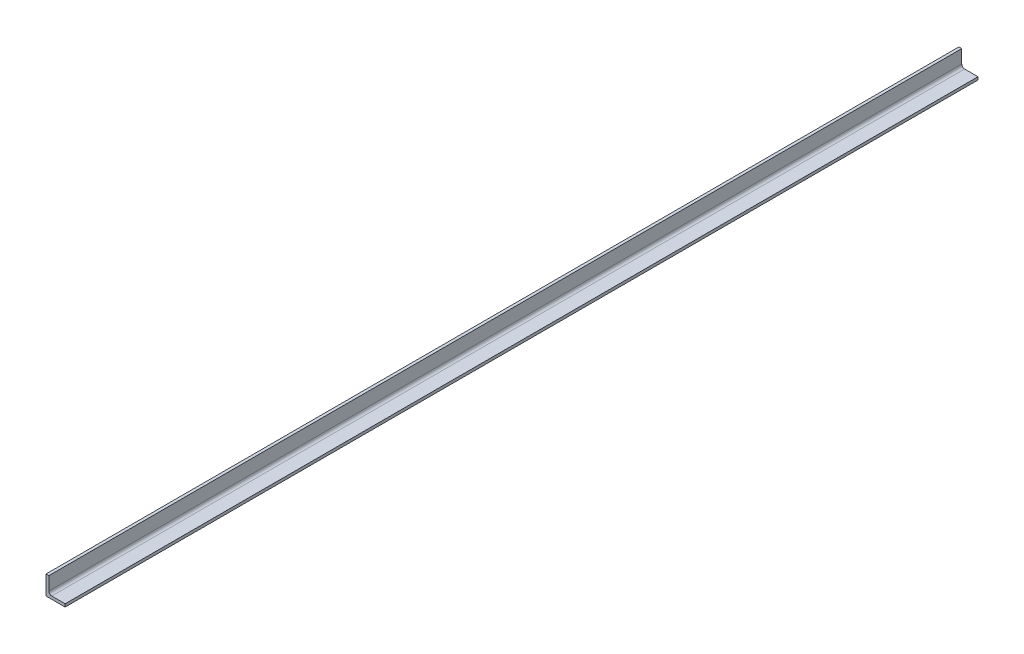
ISO-10303-21;
HEADER;
FILE_DESCRIPTION(('STEP AP214'),'2;1');
FILE_NAME('part.step','',(''),(''),'','','');
FILE_SCHEMA(('AUTOMOTIVE_DESIGN { 1 0 10303 214 1 1 1 1 }'));
ENDSEC;
DATA;
#1=APPLICATION_CONTEXT('core data for automotive mechanical design processes');
#2=APPLICATION_PROTOCOL_DEFINITION('international standard','automotive_design',2000,#1);
#3=PRODUCT_CONTEXT('',#1,'mechanical');
#4=PRODUCT('Part','Part','',(#3));
#5=PRODUCT_RELATED_PRODUCT_CATEGORY('part','',(#4));
#6=PRODUCT_DEFINITION_FORMATION('','',#4);
#7=PRODUCT_DEFINITION_CONTEXT('part definition',#1,'design');
#8=PRODUCT_DEFINITION('design','',#6,#7);
#9=PRODUCT_DEFINITION_SHAPE('','',#8);
#10=(LENGTH_UNIT() NAMED_UNIT(*) SI_UNIT(.MILLI.,.METRE.));
#11=(NAMED_UNIT(*) PLANE_ANGLE_UNIT() SI_UNIT($,.RADIAN.));
#12=(NAMED_UNIT(*) SI_UNIT($,.STERADIAN.) SOLID_ANGLE_UNIT());
#13=UNCERTAINTY_MEASURE_WITH_UNIT(LENGTH_MEASURE(1.E-05),#10,'distance_accuracy_value','');
#14=(GEOMETRIC_REPRESENTATION_CONTEXT(3) GLOBAL_UNCERTAINTY_ASSIGNED_CONTEXT((#13)) GLOBAL_UNIT_ASSIGNED_CONTEXT((#10,
#11,#12)) REPRESENTATION_CONTEXT('',''));
#15=CARTESIAN_POINT('',(0.,0.,0.));
#16=DIRECTION('',(0.,0.,1.));
#17=DIRECTION('',(1.,0.,0.));
#18=AXIS2_PLACEMENT_3D('',#15,#16,#17);
#19=CARTESIAN_POINT('',(20.,0.,955.));
#20=DIRECTION('',(0.,1.,0.));
#21=DIRECTION('',(-1.,0.,0.));
#22=AXIS2_PLACEMENT_3D('',#19,#20,#21);
#23=PLANE('',#22);
#24=DIRECTION('',(1.,0.,0.));
#25=VECTOR('',#24,1.);
#26=CARTESIAN_POINT('',(20.,0.,0.));
#27=LINE('',#26,#25);
#28=CARTESIAN_POINT('',(0.,0.,0.));
#29=VERTEX_POINT('',#28);
#30=CARTESIAN_POINT('',(20.,0.,0.));
#31=VERTEX_POINT('',#30);
#32=EDGE_CURVE('E123',#29,#31,#27,.T.);
#33=ORIENTED_EDGE('',*,*,#32,.T.);
#34=DIRECTION('',(0.,0.,-1.));
#35=VECTOR('',#34,1.);
#36=CARTESIAN_POINT('',(20.,0.,955.));
#37=LINE('',#36,#35);
#38=CARTESIAN_POINT('',(20.,0.,955.));
#39=VERTEX_POINT('',#38);
#40=EDGE_CURVE('E11',#39,#31,#37,.T.);
#41=ORIENTED_EDGE('',*,*,#40,.F.);
#42=DIRECTION('',(1.,0.,0.));
#43=VECTOR('',#42,1.);
#44=CARTESIAN_POINT('',(20.,0.,955.));
#45=LINE('',#44,#43);
#46=CARTESIAN_POINT('',(0.,0.,955.));
#47=VERTEX_POINT('',#46);
#48=EDGE_CURVE('E135',#47,#39,#45,.T.);
#49=ORIENTED_EDGE('',*,*,#48,.F.);
#50=DIRECTION('',(0.,0.,-1.));
#51=VECTOR('',#50,1.);
#52=CARTESIAN_POINT('',(0.,0.,955.));
#53=LINE('',#52,#51);
#54=EDGE_CURVE('E119',#47,#29,#53,.T.);
#55=ORIENTED_EDGE('',*,*,#54,.T.);
#56=EDGE_LOOP('',(#33,#41,#49,#55));
#57=FACE_BOUND('',#56,.T.);
#58=ADVANCED_FACE('F33',(#57),#23,.F.);
#59=CARTESIAN_POINT('',(20.,3.,955.));
#60=DIRECTION('',(-1.,0.,0.));
#61=DIRECTION('',(0.,0.,1.));
#62=AXIS2_PLACEMENT_3D('',#59,#60,#61);
#63=PLANE('',#62);
#64=DIRECTION('',(0.,1.,0.));
#65=VECTOR('',#64,1.);
#66=CARTESIAN_POINT('',(20.,3.,0.));
#67=LINE('',#66,#65);
#68=CARTESIAN_POINT('',(20.,3.,0.));
#69=VERTEX_POINT('',#68);
#70=EDGE_CURVE('E126',#31,#69,#67,.T.);
#71=ORIENTED_EDGE('',*,*,#70,.T.);
#72=DIRECTION('',(0.,0.,-1.));
#73=VECTOR('',#72,1.);
#74=CARTESIAN_POINT('',(20.,3.,955.));
#75=LINE('',#74,#73);
#76=CARTESIAN_POINT('',(20.,3.,955.));
#77=VERTEX_POINT('',#76);
#78=EDGE_CURVE('E41',#77,#69,#75,.T.);
#79=ORIENTED_EDGE('',*,*,#78,.F.);
#80=DIRECTION('',(0.,1.,0.));
#81=VECTOR('',#80,1.);
#82=CARTESIAN_POINT('',(20.,3.,955.));
#83=LINE('',#82,#81);
#84=EDGE_CURVE('E89',#39,#77,#83,.T.);
#85=ORIENTED_EDGE('',*,*,#84,.F.);
#86=ORIENTED_EDGE('',*,*,#40,.T.);
#87=EDGE_LOOP('',(#71,#79,#85,#86));
#88=FACE_BOUND('',#87,.T.);
#89=ADVANCED_FACE('F160',(#88),#63,.F.);
#90=CARTESIAN_POINT('',(6.00000000000002,3.,955.));
#91=DIRECTION('',(0.,-1.,0.));
#92=DIRECTION('',(1.,0.,0.));
#93=AXIS2_PLACEMENT_3D('',#90,#91,#92);
#94=PLANE('',#93);
#95=DIRECTION('',(-1.,0.,0.));
#96=VECTOR('',#95,1.);
#97=CARTESIAN_POINT('',(6.00000000000002,3.,0.));
#98=LINE('',#97,#96);
#99=CARTESIAN_POINT('',(6.00000000000002,3.,0.));
#100=VERTEX_POINT('',#99);
#101=EDGE_CURVE('E128',#69,#100,#98,.T.);
#102=ORIENTED_EDGE('',*,*,#101,.T.);
#103=DIRECTION('',(0.,0.,-1.));
#104=VECTOR('',#103,1.);
#105=CARTESIAN_POINT('',(6.00000000000002,3.,955.));
#106=LINE('',#105,#104);
#107=CARTESIAN_POINT('',(6.00000000000002,3.,955.));
#108=VERTEX_POINT('',#107);
#109=EDGE_CURVE('E139',#108,#100,#106,.T.);
#110=ORIENTED_EDGE('',*,*,#109,.F.);
#111=DIRECTION('',(-1.,0.,0.));
#112=VECTOR('',#111,1.);
#113=CARTESIAN_POINT('',(6.00000000000002,3.,955.));
#114=LINE('',#113,#112);
#115=EDGE_CURVE('E147',#77,#108,#114,.T.);
#116=ORIENTED_EDGE('',*,*,#115,.F.);
#117=ORIENTED_EDGE('',*,*,#78,.T.);
#118=EDGE_LOOP('',(#102,#110,#116,#117));
#119=FACE_BOUND('',#118,.T.);
#120=ADVANCED_FACE('F145',(#119),#94,.F.);
#121=CARTESIAN_POINT('',(6.,6.,955.));
#122=DIRECTION('',(0.,0.,-1.));
#123=DIRECTION('',(-1.,0.,0.));
#124=AXIS2_PLACEMENT_3D('',#121,#122,#123);
#125=CYLINDRICAL_SURFACE('',#124,3.);
#126=CARTESIAN_POINT('',(6.,6.,0.));
#127=DIRECTION('',(0.,0.,-1.));
#128=DIRECTION('',(1.,0.,0.));
#129=AXIS2_PLACEMENT_3D('',#126,#127,#128);
#130=CIRCLE('',#129,3.);
#131=CARTESIAN_POINT('',(3.,6.00000000000002,0.));
#132=VERTEX_POINT('',#131);
#133=EDGE_CURVE('E130',#100,#132,#130,.T.);
#134=ORIENTED_EDGE('',*,*,#133,.T.);
#135=DIRECTION('',(0.,0.,-1.));
#136=VECTOR('',#135,1.);
#137=CARTESIAN_POINT('',(3.,6.00000000000002,955.));
#138=LINE('',#137,#136);
#139=CARTESIAN_POINT('',(3.,6.00000000000002,955.));
#140=VERTEX_POINT('',#139);
#141=EDGE_CURVE('E114',#140,#132,#138,.T.);
#142=ORIENTED_EDGE('',*,*,#141,.F.);
#143=CARTESIAN_POINT('',(6.,6.,955.));
#144=DIRECTION('',(0.,0.,-1.));
#145=DIRECTION('',(1.,0.,0.));
#146=AXIS2_PLACEMENT_3D('',#143,#144,#145);
#147=CIRCLE('',#146,3.);
#148=EDGE_CURVE('E105',#108,#140,#147,.T.);
#149=ORIENTED_EDGE('',*,*,#148,.F.);
#150=ORIENTED_EDGE('',*,*,#109,.T.);
#151=EDGE_LOOP('',(#134,#142,#149,#150));
#152=FACE_BOUND('',#151,.T.);
#153=ADVANCED_FACE('F153',(#152),#125,.F.);
#154=CARTESIAN_POINT('',(3.,20.,955.));
#155=DIRECTION('',(-1.,0.,0.));
#156=DIRECTION('',(0.,-1.,0.));
#157=AXIS2_PLACEMENT_3D('',#154,#155,#156);
#158=PLANE('',#157);
#159=DIRECTION('',(0.,1.,0.));
#160=VECTOR('',#159,1.);
#161=CARTESIAN_POINT('',(3.,20.,0.));
#162=LINE('',#161,#160);
#163=CARTESIAN_POINT('',(3.,20.,0.));
#164=VERTEX_POINT('',#163);
#165=EDGE_CURVE('E113',#132,#164,#162,.T.);
#166=ORIENTED_EDGE('',*,*,#165,.T.);
#167=DIRECTION('',(0.,0.,-1.));
#168=VECTOR('',#167,1.);
#169=CARTESIAN_POINT('',(3.,20.,955.));
#170=LINE('',#169,#168);
#171=CARTESIAN_POINT('',(3.,20.,955.));
#172=VERTEX_POINT('',#171);
#173=EDGE_CURVE('E110',#172,#164,#170,.T.);
#174=ORIENTED_EDGE('',*,*,#173,.F.);
#175=DIRECTION('',(0.,1.,0.));
#176=VECTOR('',#175,1.);
#177=CARTESIAN_POINT('',(3.,20.,955.));
#178=LINE('',#177,#176);
#179=EDGE_CURVE('E99',#140,#172,#178,.T.);
#180=ORIENTED_EDGE('',*,*,#179,.F.);
#181=ORIENTED_EDGE('',*,*,#141,.T.);
#182=EDGE_LOOP('',(#166,#174,#180,#181));
#183=FACE_BOUND('',#182,.T.);
#184=ADVANCED_FACE('F111',(#183),#158,.F.);
#185=CARTESIAN_POINT('',(0.,20.,955.));
#186=DIRECTION('',(0.,-1.,0.));
#187=DIRECTION('',(0.,0.,-1.));
#188=AXIS2_PLACEMENT_3D('',#185,#186,#187);
#189=PLANE('',#188);
#190=DIRECTION('',(-1.,0.,0.));
#191=VECTOR('',#190,1.);
#192=CARTESIAN_POINT('',(0.,20.,0.));
#193=LINE('',#192,#191);
#194=CARTESIAN_POINT('',(0.,20.,0.));
#195=VERTEX_POINT('',#194);
#196=EDGE_CURVE('E75',#164,#195,#193,.T.);
#197=ORIENTED_EDGE('',*,*,#196,.T.);
#198=DIRECTION('',(0.,0.,-1.));
#199=VECTOR('',#198,1.);
#200=CARTESIAN_POINT('',(0.,20.,955.));
#201=LINE('',#200,#199);
#202=CARTESIAN_POINT('',(0.,20.,955.));
#203=VERTEX_POINT('',#202);
#204=EDGE_CURVE('E115',#203,#195,#201,.T.);
#205=ORIENTED_EDGE('',*,*,#204,.F.);
#206=DIRECTION('',(-1.,0.,0.));
#207=VECTOR('',#206,1.);
#208=CARTESIAN_POINT('',(0.,20.,955.));
#209=LINE('',#208,#207);
#210=EDGE_CURVE('E103',#172,#203,#209,.T.);
#211=ORIENTED_EDGE('',*,*,#210,.F.);
#212=ORIENTED_EDGE('',*,*,#173,.T.);
#213=EDGE_LOOP('',(#197,#205,#211,#212));
#214=FACE_BOUND('',#213,.T.);
#215=ADVANCED_FACE('F117',(#214),#189,.F.);
#216=CARTESIAN_POINT('',(0.,0.,955.));
#217=DIRECTION('',(1.,0.,0.));
#218=DIRECTION('',(0.,0.,-1.));
#219=AXIS2_PLACEMENT_3D('',#216,#217,#218);
#220=PLANE('',#219);
#221=DIRECTION('',(0.,-1.,0.));
#222=VECTOR('',#221,1.);
#223=CARTESIAN_POINT('',(0.,0.,0.));
#224=LINE('',#223,#222);
#225=EDGE_CURVE('E81',#195,#29,#224,.T.);
#226=ORIENTED_EDGE('',*,*,#225,.T.);
#227=ORIENTED_EDGE('',*,*,#54,.F.);
#228=DIRECTION('',(0.,-1.,0.));
#229=VECTOR('',#228,1.);
#230=CARTESIAN_POINT('',(0.,0.,955.));
#231=LINE('',#230,#229);
#232=EDGE_CURVE('E49',#203,#47,#231,.T.);
#233=ORIENTED_EDGE('',*,*,#232,.F.);
#234=ORIENTED_EDGE('',*,*,#204,.T.);
#235=EDGE_LOOP('',(#226,#227,#233,#234));
#236=FACE_BOUND('',#235,.T.);
#237=ADVANCED_FACE('F174',(#236),#220,.F.);
#238=CARTESIAN_POINT('',(6.,6.,955.));
#239=DIRECTION('',(0.,0.,1.));
#240=DIRECTION('',(1.,0.,0.));
#241=AXIS2_PLACEMENT_3D('',#238,#239,#240);
#242=PLANE('',#241);
#243=ORIENTED_EDGE('',*,*,#48,.T.);
#244=ORIENTED_EDGE('',*,*,#84,.T.);
#245=ORIENTED_EDGE('',*,*,#115,.T.);
#246=ORIENTED_EDGE('',*,*,#148,.T.);
#247=ORIENTED_EDGE('',*,*,#179,.T.);
#248=ORIENTED_EDGE('',*,*,#210,.T.);
#249=ORIENTED_EDGE('',*,*,#232,.T.);
#250=EDGE_LOOP('',(#243,#244,#245,#246,#247,#248,#249));
#251=FACE_BOUND('',#250,.T.);
#252=ADVANCED_FACE('F101',(#251),#242,.T.);
#253=CARTESIAN_POINT('',(6.,6.,0.));
#254=DIRECTION('',(0.,0.,1.));
#255=DIRECTION('',(1.,0.,0.));
#256=AXIS2_PLACEMENT_3D('',#253,#254,#255);
#257=PLANE('',#256);
#258=ORIENTED_EDGE('',*,*,#32,.F.);
#259=ORIENTED_EDGE('',*,*,#225,.F.);
#260=ORIENTED_EDGE('',*,*,#196,.F.);
#261=ORIENTED_EDGE('',*,*,#165,.F.);
#262=ORIENTED_EDGE('',*,*,#133,.F.);
#263=ORIENTED_EDGE('',*,*,#101,.F.);
#264=ORIENTED_EDGE('',*,*,#70,.F.);
#265=EDGE_LOOP('',(#258,#259,#260,#261,#262,#263,#264));
#266=FACE_BOUND('',#265,.T.);
#267=ADVANCED_FACE('F151',(#266),#257,.F.);
#268=CLOSED_SHELL('',(#58,#89,#120,#153,#184,#215,#237,#252,#267));
#269=MANIFOLD_SOLID_BREP('B2',#268);
#270=ADVANCED_BREP_SHAPE_REPRESENTATION('',(#18,#269),#14);
#271=SHAPE_DEFINITION_REPRESENTATION(#9,#270);
ENDSEC;
END-ISO-10303-21;
